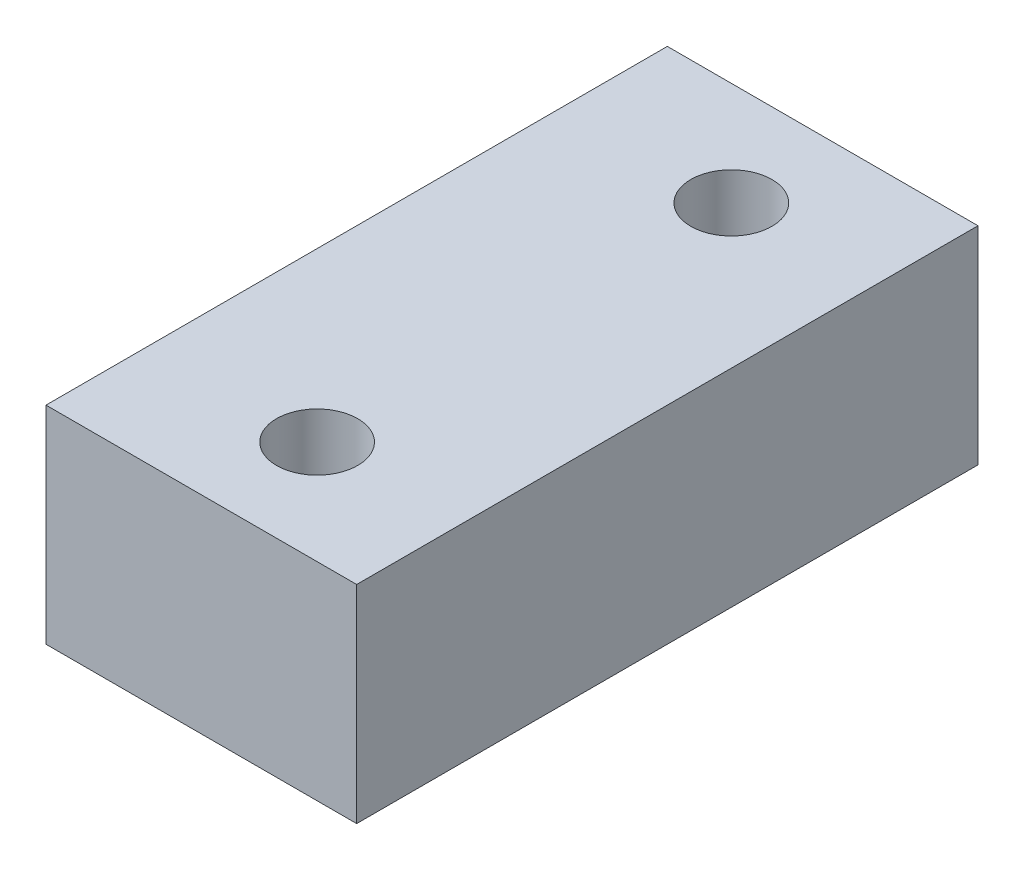
ISO-10303-21;
HEADER;
FILE_DESCRIPTION(('STEP AP214'),'2;1');
FILE_NAME('part.step','',(''),(''),'','','');
FILE_SCHEMA(('AUTOMOTIVE_DESIGN { 1 0 10303 214 1 1 1 1 }'));
ENDSEC;
DATA;
#1=APPLICATION_CONTEXT('core data for automotive mechanical design processes');
#2=APPLICATION_PROTOCOL_DEFINITION('international standard','automotive_design',2000,#1);
#3=PRODUCT_CONTEXT('',#1,'mechanical');
#4=PRODUCT('Part','Part','',(#3));
#5=PRODUCT_RELATED_PRODUCT_CATEGORY('part','',(#4));
#6=PRODUCT_DEFINITION_FORMATION('','',#4);
#7=PRODUCT_DEFINITION_CONTEXT('part definition',#1,'design');
#8=PRODUCT_DEFINITION('design','',#6,#7);
#9=PRODUCT_DEFINITION_SHAPE('','',#8);
#10=(LENGTH_UNIT() NAMED_UNIT(*) SI_UNIT(.MILLI.,.METRE.));
#11=(NAMED_UNIT(*) PLANE_ANGLE_UNIT() SI_UNIT($,.RADIAN.));
#12=(NAMED_UNIT(*) SI_UNIT($,.STERADIAN.) SOLID_ANGLE_UNIT());
#13=UNCERTAINTY_MEASURE_WITH_UNIT(LENGTH_MEASURE(1.E-05),#10,'distance_accuracy_value','');
#14=(GEOMETRIC_REPRESENTATION_CONTEXT(3) GLOBAL_UNCERTAINTY_ASSIGNED_CONTEXT((#13)) GLOBAL_UNIT_ASSIGNED_CONTEXT((#10,
#11,#12)) REPRESENTATION_CONTEXT('',''));
#15=CARTESIAN_POINT('',(0.,0.,0.));
#16=DIRECTION('',(0.,0.,1.));
#17=DIRECTION('',(1.,0.,0.));
#18=AXIS2_PLACEMENT_3D('',#15,#16,#17);
#19=CARTESIAN_POINT('',(0.,0.,0.));
#20=DIRECTION('',(0.,-1.,0.));
#21=DIRECTION('',(0.,0.,-1.));
#22=AXIS2_PLACEMENT_3D('',#19,#20,#21);
#23=PLANE('',#22);
#24=DIRECTION('',(1.,0.,0.));
#25=VECTOR('',#24,1.);
#26=CARTESIAN_POINT('',(-52.558792588351,0.,12.8171018634932));
#27=LINE('',#26,#25);
#28=CARTESIAN_POINT('',(-71.608792588351,0.,12.8171018634932));
#29=VERTEX_POINT('',#28);
#30=CARTESIAN_POINT('',(-52.558792588351,0.,12.8171018634932));
#31=VERTEX_POINT('',#30);
#32=EDGE_CURVE('E100',#29,#31,#27,.T.);
#33=ORIENTED_EDGE('',*,*,#32,.F.);
#34=DIRECTION('',(0.,0.,1.));
#35=VECTOR('',#34,1.);
#36=CARTESIAN_POINT('',(-71.608792588351,0.,-6.23289813650677));
#37=LINE('',#36,#35);
#38=CARTESIAN_POINT('',(-71.608792588351,0.,-25.2828981365068));
#39=VERTEX_POINT('',#38);
#40=EDGE_CURVE('E120',#39,#29,#37,.T.);
#41=ORIENTED_EDGE('',*,*,#40,.F.);
#42=DIRECTION('',(-1.,0.,0.));
#43=VECTOR('',#42,1.);
#44=CARTESIAN_POINT('',(-71.608792588351,0.,-25.2828981365068));
#45=LINE('',#44,#43);
#46=CARTESIAN_POINT('',(-52.558792588351,0.,-25.2828981365068));
#47=VERTEX_POINT('',#46);
#48=EDGE_CURVE('E86',#47,#39,#45,.T.);
#49=ORIENTED_EDGE('',*,*,#48,.F.);
#50=DIRECTION('',(0.,0.,-1.));
#51=VECTOR('',#50,1.);
#52=CARTESIAN_POINT('',(-52.558792588351,0.,-25.2828981365068));
#53=LINE('',#52,#51);
#54=EDGE_CURVE('E79',#31,#47,#53,.T.);
#55=ORIENTED_EDGE('',*,*,#54,.F.);
#56=EDGE_LOOP('',(#33,#41,#49,#55));
#57=FACE_BOUND('',#56,.T.);
#58=CARTESIAN_POINT('',(-61.333792588351,0.,6.46710186349322));
#59=DIRECTION('',(0.,1.,0.));
#60=DIRECTION('',(0.,0.,1.));
#61=AXIS2_PLACEMENT_3D('',#58,#59,#60);
#62=CIRCLE('',#61,2.4892);
#63=CARTESIAN_POINT('',(-61.333792588351,0.,8.95630186349321));
#64=VERTEX_POINT('',#63);
#65=EDGE_CURVE('E115',#64,#64,#62,.T.);
#66=ORIENTED_EDGE('',*,*,#65,.T.);
#67=EDGE_LOOP('',(#66));
#68=FACE_BOUND('',#67,.T.);
#69=CARTESIAN_POINT('',(-61.333792588351,0.,-18.9328981365068));
#70=DIRECTION('',(0.,1.,0.));
#71=DIRECTION('',(0.,0.,1.));
#72=AXIS2_PLACEMENT_3D('',#69,#70,#71);
#73=CIRCLE('',#72,2.4892);
#74=CARTESIAN_POINT('',(-61.333792588351,0.,-16.4436981365068));
#75=VERTEX_POINT('',#74);
#76=EDGE_CURVE('E158',#75,#75,#73,.T.);
#77=ORIENTED_EDGE('',*,*,#76,.T.);
#78=EDGE_LOOP('',(#77));
#79=FACE_BOUND('',#78,.T.);
#80=ADVANCED_FACE('F43',(#57,#68,#79),#23,.T.);
#81=CARTESIAN_POINT('',(-52.558792588351,12.7,12.8171018634932));
#82=DIRECTION('',(0.,0.,-1.));
#83=DIRECTION('',(-1.,0.,0.));
#84=AXIS2_PLACEMENT_3D('',#81,#82,#83);
#85=PLANE('',#84);
#86=ORIENTED_EDGE('',*,*,#32,.T.);
#87=DIRECTION('',(0.,-1.,0.));
#88=VECTOR('',#87,1.);
#89=CARTESIAN_POINT('',(-52.558792588351,12.7,12.8171018634932));
#90=LINE('',#89,#88);
#91=CARTESIAN_POINT('',(-52.558792588351,12.7,12.8171018634932));
#92=VERTEX_POINT('',#91);
#93=EDGE_CURVE('E53',#92,#31,#90,.T.);
#94=ORIENTED_EDGE('',*,*,#93,.F.);
#95=DIRECTION('',(1.,0.,0.));
#96=VECTOR('',#95,1.);
#97=CARTESIAN_POINT('',(-52.558792588351,12.7,12.8171018634932));
#98=LINE('',#97,#96);
#99=CARTESIAN_POINT('',(-71.608792588351,12.7,12.8171018634932));
#100=VERTEX_POINT('',#99);
#101=EDGE_CURVE('E92',#100,#92,#98,.T.);
#102=ORIENTED_EDGE('',*,*,#101,.F.);
#103=DIRECTION('',(0.,-1.,0.));
#104=VECTOR('',#103,1.);
#105=CARTESIAN_POINT('',(-71.608792588351,12.7,12.8171018634932));
#106=LINE('',#105,#104);
#107=EDGE_CURVE('E11',#100,#29,#106,.T.);
#108=ORIENTED_EDGE('',*,*,#107,.T.);
#109=EDGE_LOOP('',(#86,#94,#102,#108));
#110=FACE_BOUND('',#109,.T.);
#111=ADVANCED_FACE('F45',(#110),#85,.F.);
#112=CARTESIAN_POINT('',(-52.558792588351,12.7,-25.2828981365068));
#113=DIRECTION('',(-1.,0.,0.));
#114=DIRECTION('',(0.,0.,1.));
#115=AXIS2_PLACEMENT_3D('',#112,#113,#114);
#116=PLANE('',#115);
#117=ORIENTED_EDGE('',*,*,#54,.T.);
#118=DIRECTION('',(0.,-1.,0.));
#119=VECTOR('',#118,1.);
#120=CARTESIAN_POINT('',(-52.558792588351,12.7,-25.2828981365068));
#121=LINE('',#120,#119);
#122=CARTESIAN_POINT('',(-52.558792588351,12.7,-25.2828981365068));
#123=VERTEX_POINT('',#122);
#124=EDGE_CURVE('E102',#123,#47,#121,.T.);
#125=ORIENTED_EDGE('',*,*,#124,.F.);
#126=DIRECTION('',(0.,0.,-1.));
#127=VECTOR('',#126,1.);
#128=CARTESIAN_POINT('',(-52.558792588351,12.7,-25.2828981365068));
#129=LINE('',#128,#127);
#130=EDGE_CURVE('E96',#92,#123,#129,.T.);
#131=ORIENTED_EDGE('',*,*,#130,.F.);
#132=ORIENTED_EDGE('',*,*,#93,.T.);
#133=EDGE_LOOP('',(#117,#125,#131,#132));
#134=FACE_BOUND('',#133,.T.);
#135=ADVANCED_FACE('F103',(#134),#116,.F.);
#136=CARTESIAN_POINT('',(-71.608792588351,12.7,-25.2828981365068));
#137=DIRECTION('',(0.,0.,1.));
#138=DIRECTION('',(1.,0.,0.));
#139=AXIS2_PLACEMENT_3D('',#136,#137,#138);
#140=PLANE('',#139);
#141=ORIENTED_EDGE('',*,*,#48,.T.);
#142=DIRECTION('',(0.,-1.,0.));
#143=VECTOR('',#142,1.);
#144=CARTESIAN_POINT('',(-71.608792588351,12.7,-25.2828981365068));
#145=LINE('',#144,#143);
#146=CARTESIAN_POINT('',(-71.608792588351,12.7,-25.2828981365068));
#147=VERTEX_POINT('',#146);
#148=EDGE_CURVE('E109',#147,#39,#145,.T.);
#149=ORIENTED_EDGE('',*,*,#148,.F.);
#150=DIRECTION('',(-1.,0.,0.));
#151=VECTOR('',#150,1.);
#152=CARTESIAN_POINT('',(-71.608792588351,12.7,-25.2828981365068));
#153=LINE('',#152,#151);
#154=EDGE_CURVE('E106',#123,#147,#153,.T.);
#155=ORIENTED_EDGE('',*,*,#154,.F.);
#156=ORIENTED_EDGE('',*,*,#124,.T.);
#157=EDGE_LOOP('',(#141,#149,#155,#156));
#158=FACE_BOUND('',#157,.T.);
#159=ADVANCED_FACE('F126',(#158),#140,.F.);
#160=CARTESIAN_POINT('',(-71.608792588351,12.7,-6.23289813650677));
#161=DIRECTION('',(1.,0.,0.));
#162=DIRECTION('',(0.,0.,-1.));
#163=AXIS2_PLACEMENT_3D('',#160,#161,#162);
#164=PLANE('',#163);
#165=ORIENTED_EDGE('',*,*,#40,.T.);
#166=ORIENTED_EDGE('',*,*,#107,.F.);
#167=DIRECTION('',(0.,0.,1.));
#168=VECTOR('',#167,1.);
#169=CARTESIAN_POINT('',(-71.608792588351,12.7,12.8171018634932));
#170=LINE('',#169,#168);
#171=EDGE_CURVE('E61',#147,#100,#170,.T.);
#172=ORIENTED_EDGE('',*,*,#171,.F.);
#173=ORIENTED_EDGE('',*,*,#148,.T.);
#174=EDGE_LOOP('',(#165,#166,#172,#173));
#175=FACE_BOUND('',#174,.T.);
#176=ADVANCED_FACE('F130',(#175),#164,.F.);
#177=CARTESIAN_POINT('',(0.,12.7,0.));
#178=DIRECTION('',(0.,-1.,0.));
#179=DIRECTION('',(0.,0.,-1.));
#180=AXIS2_PLACEMENT_3D('',#177,#178,#179);
#181=PLANE('',#180);
#182=CARTESIAN_POINT('',(-61.333792588351,12.7,-18.9328981365068));
#183=DIRECTION('',(0.,1.,0.));
#184=DIRECTION('',(0.,0.,1.));
#185=AXIS2_PLACEMENT_3D('',#182,#183,#184);
#186=CIRCLE('',#185,2.48919999999999);
#187=CARTESIAN_POINT('',(-61.333792588351,12.7,-16.4436981365068));
#188=VERTEX_POINT('',#187);
#189=EDGE_CURVE('E161',#188,#188,#186,.T.);
#190=ORIENTED_EDGE('',*,*,#189,.F.);
#191=EDGE_LOOP('',(#190));
#192=FACE_BOUND('',#191,.T.);
#193=CARTESIAN_POINT('',(-61.333792588351,12.7,6.46710186349322));
#194=DIRECTION('',(0.,1.,0.));
#195=DIRECTION('',(0.,0.,1.));
#196=AXIS2_PLACEMENT_3D('',#193,#194,#195);
#197=CIRCLE('',#196,2.48919999999999);
#198=CARTESIAN_POINT('',(-61.333792588351,12.7,8.95630186349321));
#199=VERTEX_POINT('',#198);
#200=EDGE_CURVE('E165',#199,#199,#197,.T.);
#201=ORIENTED_EDGE('',*,*,#200,.F.);
#202=EDGE_LOOP('',(#201));
#203=FACE_BOUND('',#202,.T.);
#204=ORIENTED_EDGE('',*,*,#171,.T.);
#205=ORIENTED_EDGE('',*,*,#101,.T.);
#206=ORIENTED_EDGE('',*,*,#130,.T.);
#207=ORIENTED_EDGE('',*,*,#154,.T.);
#208=EDGE_LOOP('',(#204,#205,#206,#207));
#209=FACE_BOUND('',#208,.T.);
#210=ADVANCED_FACE('F94',(#192,#203,#209),#181,.F.);
#211=CARTESIAN_POINT('',(-61.333792588351,12.7,6.46710186349322));
#212=DIRECTION('',(0.,1.,0.));
#213=DIRECTION('',(0.,0.,1.));
#214=AXIS2_PLACEMENT_3D('',#211,#212,#213);
#215=CYLINDRICAL_SURFACE('',#214,2.48919999999999);
#216=ORIENTED_EDGE('',*,*,#65,.F.);
#217=EDGE_LOOP('',(#216));
#218=FACE_BOUND('',#217,.T.);
#219=ORIENTED_EDGE('',*,*,#200,.T.);
#220=EDGE_LOOP('',(#219));
#221=FACE_BOUND('',#220,.T.);
#222=ADVANCED_FACE('F137',(#218,#221),#215,.F.);
#223=CARTESIAN_POINT('',(-61.333792588351,12.7,-18.9328981365068));
#224=DIRECTION('',(0.,1.,0.));
#225=DIRECTION('',(0.,0.,1.));
#226=AXIS2_PLACEMENT_3D('',#223,#224,#225);
#227=CYLINDRICAL_SURFACE('',#226,2.48919999999999);
#228=ORIENTED_EDGE('',*,*,#76,.F.);
#229=EDGE_LOOP('',(#228));
#230=FACE_BOUND('',#229,.T.);
#231=ORIENTED_EDGE('',*,*,#189,.T.);
#232=EDGE_LOOP('',(#231));
#233=FACE_BOUND('',#232,.T.);
#234=ADVANCED_FACE('F149',(#230,#233),#227,.F.);
#235=CLOSED_SHELL('',(#80,#111,#135,#159,#176,#210,#222,#234));
#236=MANIFOLD_SOLID_BREP('B2',#235);
#237=ADVANCED_BREP_SHAPE_REPRESENTATION('',(#18,#236),#14);
#238=SHAPE_DEFINITION_REPRESENTATION(#9,#237);
ENDSEC;
END-ISO-10303-21;
